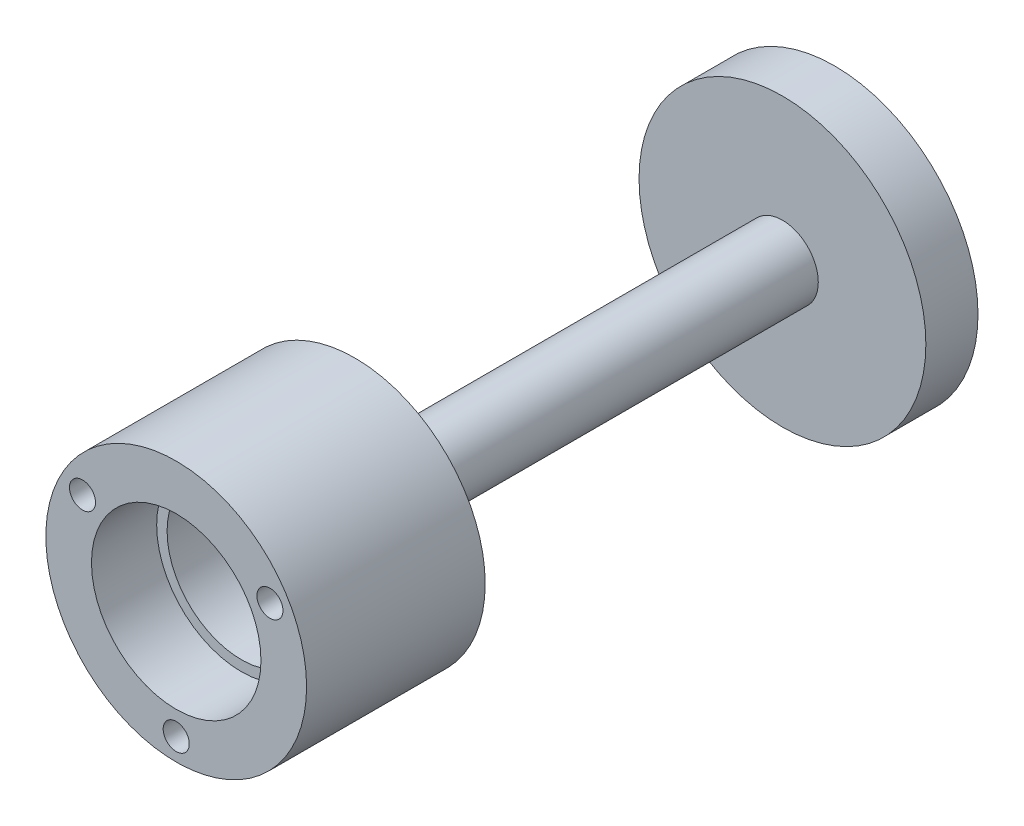
ISO-10303-21;
HEADER;
FILE_DESCRIPTION(('STEP AP214'),'2;1');
FILE_NAME('part.step','',(''),(''),'','','');
FILE_SCHEMA(('AUTOMOTIVE_DESIGN { 1 0 10303 214 1 1 1 1 }'));
ENDSEC;
DATA;
#1=APPLICATION_CONTEXT('core data for automotive mechanical design processes');
#2=APPLICATION_PROTOCOL_DEFINITION('international standard','automotive_design',2000,#1);
#3=PRODUCT_CONTEXT('',#1,'mechanical');
#4=PRODUCT('Part','Part','',(#3));
#5=PRODUCT_RELATED_PRODUCT_CATEGORY('part','',(#4));
#6=PRODUCT_DEFINITION_FORMATION('','',#4);
#7=PRODUCT_DEFINITION_CONTEXT('part definition',#1,'design');
#8=PRODUCT_DEFINITION('design','',#6,#7);
#9=PRODUCT_DEFINITION_SHAPE('','',#8);
#10=(LENGTH_UNIT() NAMED_UNIT(*) SI_UNIT(.MILLI.,.METRE.));
#11=(NAMED_UNIT(*) PLANE_ANGLE_UNIT() SI_UNIT($,.RADIAN.));
#12=(NAMED_UNIT(*) SI_UNIT($,.STERADIAN.) SOLID_ANGLE_UNIT());
#13=UNCERTAINTY_MEASURE_WITH_UNIT(LENGTH_MEASURE(1.E-05),#10,'distance_accuracy_value','');
#14=(GEOMETRIC_REPRESENTATION_CONTEXT(3) GLOBAL_UNCERTAINTY_ASSIGNED_CONTEXT((#13)) GLOBAL_UNIT_ASSIGNED_CONTEXT((#10,
#11,#12)) REPRESENTATION_CONTEXT('',''));
#15=CARTESIAN_POINT('',(0.,0.,0.));
#16=DIRECTION('',(0.,0.,1.));
#17=DIRECTION('',(1.,0.,0.));
#18=AXIS2_PLACEMENT_3D('',#15,#16,#17);
#19=CARTESIAN_POINT('',(0.,0.,32.81));
#20=DIRECTION('',(0.,0.,-1.));
#21=DIRECTION('',(-1.,0.,0.));
#22=AXIS2_PLACEMENT_3D('',#19,#20,#21);
#23=CYLINDRICAL_SURFACE('',#22,2.75);
#24=CARTESIAN_POINT('',(0.,0.,0.));
#25=DIRECTION('',(0.,0.,1.));
#26=DIRECTION('',(1.,0.,0.));
#27=AXIS2_PLACEMENT_3D('',#24,#25,#26);
#28=CIRCLE('',#27,2.75);
#29=CARTESIAN_POINT('',(2.75,0.,0.));
#30=VERTEX_POINT('',#29);
#31=EDGE_CURVE('E46',#30,#30,#28,.T.);
#32=ORIENTED_EDGE('',*,*,#31,.T.);
#33=EDGE_LOOP('',(#32));
#34=FACE_BOUND('',#33,.T.);
#35=CARTESIAN_POINT('',(0.,0.,32.8));
#36=DIRECTION('',(0.,0.,1.));
#37=DIRECTION('',(1.,0.,0.));
#38=AXIS2_PLACEMENT_3D('',#35,#36,#37);
#39=CIRCLE('',#38,2.75);
#40=CARTESIAN_POINT('',(2.75,0.,32.8));
#41=VERTEX_POINT('',#40);
#42=EDGE_CURVE('E10',#41,#41,#39,.T.);
#43=ORIENTED_EDGE('',*,*,#42,.F.);
#44=EDGE_LOOP('',(#43));
#45=FACE_BOUND('',#44,.T.);
#46=ADVANCED_FACE('F39',(#34,#45),#23,.T.);
#47=CARTESIAN_POINT('',(0.,0.,0.));
#48=DIRECTION('',(0.,0.,-1.));
#49=DIRECTION('',(-1.,0.,0.));
#50=AXIS2_PLACEMENT_3D('',#47,#48,#49);
#51=CYLINDRICAL_SURFACE('',#50,11.);
#52=CARTESIAN_POINT('',(0.,0.,0.));
#53=DIRECTION('',(0.,0.,1.));
#54=DIRECTION('',(1.,0.,0.));
#55=AXIS2_PLACEMENT_3D('',#52,#53,#54);
#56=CIRCLE('',#55,11.);
#57=CARTESIAN_POINT('',(11.,0.,0.));
#58=VERTEX_POINT('',#57);
#59=EDGE_CURVE('E49',#58,#58,#56,.T.);
#60=ORIENTED_EDGE('',*,*,#59,.F.);
#61=EDGE_LOOP('',(#60));
#62=FACE_BOUND('',#61,.T.);
#63=CARTESIAN_POINT('',(0.,0.,-4.));
#64=DIRECTION('',(0.,0.,1.));
#65=DIRECTION('',(1.,0.,0.));
#66=AXIS2_PLACEMENT_3D('',#63,#64,#65);
#67=CIRCLE('',#66,11.);
#68=CARTESIAN_POINT('',(11.,0.,-4.));
#69=VERTEX_POINT('',#68);
#70=EDGE_CURVE('E54',#69,#69,#67,.T.);
#71=ORIENTED_EDGE('',*,*,#70,.T.);
#72=EDGE_LOOP('',(#71));
#73=FACE_BOUND('',#72,.T.);
#74=ADVANCED_FACE('F41',(#62,#73),#51,.T.);
#75=CARTESIAN_POINT('',(0.,0.,0.));
#76=DIRECTION('',(0.,0.,1.));
#77=DIRECTION('',(1.,0.,0.));
#78=AXIS2_PLACEMENT_3D('',#75,#76,#77);
#79=PLANE('',#78);
#80=ORIENTED_EDGE('',*,*,#31,.F.);
#81=EDGE_LOOP('',(#80));
#82=FACE_BOUND('',#81,.T.);
#83=ORIENTED_EDGE('',*,*,#59,.T.);
#84=EDGE_LOOP('',(#83));
#85=FACE_BOUND('',#84,.T.);
#86=ADVANCED_FACE('F171',(#82,#85),#79,.T.);
#87=CARTESIAN_POINT('',(0.,0.,-4.));
#88=DIRECTION('',(0.,0.,1.));
#89=DIRECTION('',(1.,0.,0.));
#90=AXIS2_PLACEMENT_3D('',#87,#88,#89);
#91=PLANE('',#90);
#92=CARTESIAN_POINT('',(7.18801085141084,4.15,-4.));
#93=DIRECTION('',(0.,0.,-1.));
#94=DIRECTION('',(-1.,0.,0.));
#95=AXIS2_PLACEMENT_3D('',#92,#93,#94);
#96=CIRCLE('',#95,1.);
#97=CARTESIAN_POINT('',(6.18801085141084,4.15,-4.));
#98=VERTEX_POINT('',#97);
#99=EDGE_CURVE('E100',#98,#98,#96,.T.);
#100=ORIENTED_EDGE('',*,*,#99,.F.);
#101=EDGE_LOOP('',(#100));
#102=FACE_BOUND('',#101,.T.);
#103=CARTESIAN_POINT('',(-7.18801085141084,4.15,-4.));
#104=DIRECTION('',(0.,0.,-1.));
#105=DIRECTION('',(-1.,0.,0.));
#106=AXIS2_PLACEMENT_3D('',#103,#104,#105);
#107=CIRCLE('',#106,1.);
#108=CARTESIAN_POINT('',(-8.18801085141084,4.15,-4.));
#109=VERTEX_POINT('',#108);
#110=EDGE_CURVE('E94',#109,#109,#107,.T.);
#111=ORIENTED_EDGE('',*,*,#110,.F.);
#112=EDGE_LOOP('',(#111));
#113=FACE_BOUND('',#112,.T.);
#114=CARTESIAN_POINT('',(0.,-8.3,-4.));
#115=DIRECTION('',(0.,0.,-1.));
#116=DIRECTION('',(-1.,0.,0.));
#117=AXIS2_PLACEMENT_3D('',#114,#115,#116);
#118=CIRCLE('',#117,1.);
#119=CARTESIAN_POINT('',(-1.,-8.3,-4.));
#120=VERTEX_POINT('',#119);
#121=EDGE_CURVE('E87',#120,#120,#118,.T.);
#122=ORIENTED_EDGE('',*,*,#121,.F.);
#123=EDGE_LOOP('',(#122));
#124=FACE_BOUND('',#123,.T.);
#125=ORIENTED_EDGE('',*,*,#70,.F.);
#126=EDGE_LOOP('',(#125));
#127=FACE_BOUND('',#126,.T.);
#128=ADVANCED_FACE('F178',(#102,#113,#124,#127),#91,.F.);
#129=CARTESIAN_POINT('',(0.,0.,35.));
#130=DIRECTION('',(0.,0.,-1.));
#131=DIRECTION('',(-1.,0.,0.));
#132=AXIS2_PLACEMENT_3D('',#129,#130,#131);
#133=CYLINDRICAL_SURFACE('',#132,10.);
#134=CARTESIAN_POINT('',(0.,0.,32.8));
#135=DIRECTION('',(0.,0.,1.));
#136=DIRECTION('',(1.,0.,0.));
#137=AXIS2_PLACEMENT_3D('',#134,#135,#136);
#138=CIRCLE('',#137,10.);
#139=CARTESIAN_POINT('',(10.,0.,32.8));
#140=VERTEX_POINT('',#139);
#141=EDGE_CURVE('E59',#140,#140,#138,.T.);
#142=ORIENTED_EDGE('',*,*,#141,.T.);
#143=EDGE_LOOP('',(#142));
#144=FACE_BOUND('',#143,.T.);
#145=CARTESIAN_POINT('',(0.,0.,46.5));
#146=DIRECTION('',(0.,0.,1.));
#147=DIRECTION('',(1.,0.,0.));
#148=AXIS2_PLACEMENT_3D('',#145,#146,#147);
#149=CIRCLE('',#148,10.);
#150=CARTESIAN_POINT('',(10.,0.,46.5));
#151=VERTEX_POINT('',#150);
#152=EDGE_CURVE('E71',#151,#151,#149,.T.);
#153=ORIENTED_EDGE('',*,*,#152,.F.);
#154=EDGE_LOOP('',(#153));
#155=FACE_BOUND('',#154,.T.);
#156=ADVANCED_FACE('F177',(#144,#155),#133,.T.);
#157=CARTESIAN_POINT('',(0.,0.,32.8));
#158=DIRECTION('',(0.,0.,1.));
#159=DIRECTION('',(1.,0.,0.));
#160=AXIS2_PLACEMENT_3D('',#157,#158,#159);
#161=PLANE('',#160);
#162=ORIENTED_EDGE('',*,*,#42,.T.);
#163=EDGE_LOOP('',(#162));
#164=FACE_BOUND('',#163,.T.);
#165=ORIENTED_EDGE('',*,*,#141,.F.);
#166=EDGE_LOOP('',(#165));
#167=FACE_BOUND('',#166,.T.);
#168=ADVANCED_FACE('F135',(#164,#167),#161,.F.);
#169=CARTESIAN_POINT('',(0.,0.,46.5));
#170=DIRECTION('',(0.,0.,1.));
#171=DIRECTION('',(1.,0.,0.));
#172=AXIS2_PLACEMENT_3D('',#169,#170,#171);
#173=PLANE('',#172);
#174=CARTESIAN_POINT('',(7.18801085141084,4.15,46.5));
#175=DIRECTION('',(0.,0.,1.));
#176=DIRECTION('',(1.,0.,0.));
#177=AXIS2_PLACEMENT_3D('',#174,#175,#176);
#178=CIRCLE('',#177,1.);
#179=CARTESIAN_POINT('',(8.18801085141084,4.15,46.5));
#180=VERTEX_POINT('',#179);
#181=EDGE_CURVE('E111',#180,#180,#178,.T.);
#182=ORIENTED_EDGE('',*,*,#181,.F.);
#183=EDGE_LOOP('',(#182));
#184=FACE_BOUND('',#183,.T.);
#185=CARTESIAN_POINT('',(-7.18801085141084,4.15,46.5));
#186=DIRECTION('',(0.,0.,1.));
#187=DIRECTION('',(1.,0.,0.));
#188=AXIS2_PLACEMENT_3D('',#185,#186,#187);
#189=CIRCLE('',#188,1.);
#190=CARTESIAN_POINT('',(-6.18801085141084,4.15,46.5));
#191=VERTEX_POINT('',#190);
#192=EDGE_CURVE('E112',#191,#191,#189,.T.);
#193=ORIENTED_EDGE('',*,*,#192,.F.);
#194=EDGE_LOOP('',(#193));
#195=FACE_BOUND('',#194,.T.);
#196=CARTESIAN_POINT('',(0.,-8.3,46.5));
#197=DIRECTION('',(0.,0.,1.));
#198=DIRECTION('',(1.,0.,0.));
#199=AXIS2_PLACEMENT_3D('',#196,#197,#198);
#200=CIRCLE('',#199,1.);
#201=CARTESIAN_POINT('',(0.999999999999999,-8.3,46.5));
#202=VERTEX_POINT('',#201);
#203=EDGE_CURVE('E104',#202,#202,#200,.T.);
#204=ORIENTED_EDGE('',*,*,#203,.F.);
#205=EDGE_LOOP('',(#204));
#206=FACE_BOUND('',#205,.T.);
#207=ORIENTED_EDGE('',*,*,#152,.T.);
#208=EDGE_LOOP('',(#207));
#209=FACE_BOUND('',#208,.T.);
#210=CARTESIAN_POINT('',(0.,0.,46.5));
#211=DIRECTION('',(0.,0.,1.));
#212=DIRECTION('',(1.,0.,0.));
#213=AXIS2_PLACEMENT_3D('',#210,#211,#212);
#214=CIRCLE('',#213,6.5);
#215=CARTESIAN_POINT('',(6.5,0.,46.5));
#216=VERTEX_POINT('',#215);
#217=EDGE_CURVE('E76',#216,#216,#214,.T.);
#218=ORIENTED_EDGE('',*,*,#217,.F.);
#219=EDGE_LOOP('',(#218));
#220=FACE_BOUND('',#219,.T.);
#221=ADVANCED_FACE('F129',(#184,#195,#206,#209,#220),#173,.T.);
#222=CARTESIAN_POINT('',(0.,0.,46.5));
#223=DIRECTION('',(0.,0.,-1.));
#224=DIRECTION('',(-1.,0.,0.));
#225=AXIS2_PLACEMENT_3D('',#222,#223,#224);
#226=CYLINDRICAL_SURFACE('',#225,6.5);
#227=ORIENTED_EDGE('',*,*,#217,.T.);
#228=EDGE_LOOP('',(#227));
#229=FACE_BOUND('',#228,.T.);
#230=CARTESIAN_POINT('',(0.,0.,41.5));
#231=DIRECTION('',(0.,0.,1.));
#232=DIRECTION('',(1.,0.,0.));
#233=AXIS2_PLACEMENT_3D('',#230,#231,#232);
#234=CIRCLE('',#233,6.5);
#235=CARTESIAN_POINT('',(6.5,0.,41.5));
#236=VERTEX_POINT('',#235);
#237=EDGE_CURVE('E80',#236,#236,#234,.T.);
#238=ORIENTED_EDGE('',*,*,#237,.F.);
#239=EDGE_LOOP('',(#238));
#240=FACE_BOUND('',#239,.T.);
#241=ADVANCED_FACE('F131',(#229,#240),#226,.F.);
#242=CARTESIAN_POINT('',(0.,0.,35.));
#243=DIRECTION('',(0.,0.,1.));
#244=DIRECTION('',(1.,0.,0.));
#245=AXIS2_PLACEMENT_3D('',#242,#243,#244);
#246=PLANE('',#245);
#247=CARTESIAN_POINT('',(0.,0.,35.));
#248=DIRECTION('',(0.,0.,1.));
#249=DIRECTION('',(1.,0.,0.));
#250=AXIS2_PLACEMENT_3D('',#247,#248,#249);
#251=CIRCLE('',#250,5.7);
#252=CARTESIAN_POINT('',(-5.7,0.,35.));
#253=VERTEX_POINT('',#252);
#254=EDGE_CURVE('E69',#253,#253,#251,.T.);
#255=ORIENTED_EDGE('',*,*,#254,.T.);
#256=EDGE_LOOP('',(#255));
#257=FACE_BOUND('',#256,.T.);
#258=ADVANCED_FACE('F144',(#257),#246,.T.);
#259=CARTESIAN_POINT('',(0.,0.,41.5));
#260=DIRECTION('',(0.,0.,-1.));
#261=DIRECTION('',(-1.,0.,0.));
#262=AXIS2_PLACEMENT_3D('',#259,#260,#261);
#263=CYLINDRICAL_SURFACE('',#262,5.7);
#264=CARTESIAN_POINT('',(0.,0.,41.5));
#265=DIRECTION('',(0.,0.,1.));
#266=DIRECTION('',(1.,0.,0.));
#267=AXIS2_PLACEMENT_3D('',#264,#265,#266);
#268=CIRCLE('',#267,5.7);
#269=CARTESIAN_POINT('',(-5.7,0.,41.5));
#270=VERTEX_POINT('',#269);
#271=EDGE_CURVE('E63',#270,#270,#268,.T.);
#272=CARTESIAN_POINT('',(-5.7,0.,41.5));
#273=CARTESIAN_POINT('',(-5.7,0.,41.4322916666667));
#274=CARTESIAN_POINT('',(-5.7,0.,41.3645833333333));
#275=CARTESIAN_POINT('',(-5.7,0.,41.2291666666667));
#276=CARTESIAN_POINT('',(-5.7,0.,41.1614583333333));
#277=CARTESIAN_POINT('',(-5.7,0.,41.0260416666667));
#278=CARTESIAN_POINT('',(-5.7,0.,40.9583333333333));
#279=CARTESIAN_POINT('',(-5.7,0.,40.8229166666667));
#280=CARTESIAN_POINT('',(-5.7,0.,40.7552083333333));
#281=CARTESIAN_POINT('',(-5.7,0.,40.6197916666667));
#282=CARTESIAN_POINT('',(-5.7,0.,40.5520833333333));
#283=CARTESIAN_POINT('',(-5.7,0.,40.4166666666667));
#284=CARTESIAN_POINT('',(-5.7,0.,40.3489583333333));
#285=CARTESIAN_POINT('',(-5.7,0.,40.2135416666667));
#286=CARTESIAN_POINT('',(-5.7,0.,40.1458333333333));
#287=CARTESIAN_POINT('',(-5.7,0.,40.0104166666667));
#288=CARTESIAN_POINT('',(-5.7,0.,39.9427083333333));
#289=CARTESIAN_POINT('',(-5.7,0.,39.8072916666667));
#290=CARTESIAN_POINT('',(-5.7,0.,39.7395833333333));
#291=CARTESIAN_POINT('',(-5.7,0.,39.6041666666667));
#292=CARTESIAN_POINT('',(-5.7,0.,39.5364583333333));
#293=CARTESIAN_POINT('',(-5.7,0.,39.4010416666667));
#294=CARTESIAN_POINT('',(-5.7,0.,39.3333333333333));
#295=CARTESIAN_POINT('',(-5.7,0.,39.1979166666667));
#296=CARTESIAN_POINT('',(-5.7,0.,39.1302083333333));
#297=CARTESIAN_POINT('',(-5.7,0.,38.9947916666667));
#298=CARTESIAN_POINT('',(-5.7,0.,38.9270833333333));
#299=CARTESIAN_POINT('',(-5.7,0.,38.7916666666667));
#300=CARTESIAN_POINT('',(-5.7,0.,38.7239583333333));
#301=CARTESIAN_POINT('',(-5.7,0.,38.5885416666667));
#302=CARTESIAN_POINT('',(-5.7,0.,38.5208333333333));
#303=CARTESIAN_POINT('',(-5.7,0.,38.3854166666667));
#304=CARTESIAN_POINT('',(-5.7,0.,38.3177083333333));
#305=CARTESIAN_POINT('',(-5.7,0.,38.1822916666667));
#306=CARTESIAN_POINT('',(-5.7,0.,38.1145833333333));
#307=CARTESIAN_POINT('',(-5.7,0.,37.9791666666667));
#308=CARTESIAN_POINT('',(-5.7,0.,37.9114583333333));
#309=CARTESIAN_POINT('',(-5.7,0.,37.7760416666667));
#310=CARTESIAN_POINT('',(-5.7,0.,37.7083333333333));
#311=CARTESIAN_POINT('',(-5.7,0.,37.5729166666667));
#312=CARTESIAN_POINT('',(-5.7,0.,37.5052083333333));
#313=CARTESIAN_POINT('',(-5.7,0.,37.3697916666667));
#314=CARTESIAN_POINT('',(-5.7,0.,37.3020833333333));
#315=CARTESIAN_POINT('',(-5.7,0.,37.1666666666667));
#316=CARTESIAN_POINT('',(-5.7,0.,37.0989583333333));
#317=CARTESIAN_POINT('',(-5.7,0.,36.9635416666667));
#318=CARTESIAN_POINT('',(-5.7,0.,36.8958333333333));
#319=CARTESIAN_POINT('',(-5.7,0.,36.7604166666667));
#320=CARTESIAN_POINT('',(-5.7,0.,36.6927083333333));
#321=CARTESIAN_POINT('',(-5.7,0.,36.5572916666667));
#322=CARTESIAN_POINT('',(-5.7,0.,36.4895833333333));
#323=CARTESIAN_POINT('',(-5.7,0.,36.3541666666667));
#324=CARTESIAN_POINT('',(-5.7,0.,36.2864583333333));
#325=CARTESIAN_POINT('',(-5.7,0.,36.1510416666667));
#326=CARTESIAN_POINT('',(-5.7,0.,36.0833333333333));
#327=CARTESIAN_POINT('',(-5.7,0.,35.9479166666667));
#328=CARTESIAN_POINT('',(-5.7,0.,35.8802083333333));
#329=CARTESIAN_POINT('',(-5.7,0.,35.7447916666667));
#330=CARTESIAN_POINT('',(-5.7,0.,35.6770833333333));
#331=CARTESIAN_POINT('',(-5.7,0.,35.5416666666667));
#332=CARTESIAN_POINT('',(-5.7,0.,35.4739583333333));
#333=CARTESIAN_POINT('',(-5.7,0.,35.3385416666667));
#334=CARTESIAN_POINT('',(-5.7,0.,35.2708333333333));
#335=CARTESIAN_POINT('',(-5.7,0.,35.1354166666667));
#336=CARTESIAN_POINT('',(-5.7,0.,35.0677083333333));
#337=CARTESIAN_POINT('',(-5.7,0.,35.));
#338=B_SPLINE_CURVE_WITH_KNOTS('',3,(#272,#273,#274,#275,#276,#277,#278,#279,#280,#281,#282,
#283,#284,#285,#286,#287,#288,#289,#290,#291,#292,#293,#294,#295,#296,#297,#298,#299,#300,#301,
#302,#303,#304,#305,#306,#307,#308,#309,#310,#311,#312,#313,#314,#315,#316,#317,#318,#319,#320,
#321,#322,#323,#324,#325,#326,#327,#328,#329,#330,#331,#332,#333,#334,#335,#336,#337),
.UNSPECIFIED.,.F.,.F.,(4,2,2,2,2,2,2,2,2,2,2,2,2,2,2,2,2,2,2,2,2,2,2,2,2,2,2,2,2,2,2,2,4),(0.,
0.203124999999998,0.406249999999997,0.609374999999995,0.812499999999994,1.015625,1.21875,
1.421875,1.62499999999999,1.828125,2.03125,2.234375,2.4375,2.64062499999999,2.84375,3.046875,
3.25,3.45312499999999,3.65625,3.859375,4.0625,4.26562499999999,4.46874999999999,4.671875,4.875,
5.078125,5.28124999999999,5.484375,5.6875,5.890625,6.09374999999999,6.29687499999999,6.5),.UNSPECIFIED.);
#339=EDGE_CURVE('BSEAM155',#270,#253,#338,.T.);
#340=ORIENTED_EDGE('',*,*,#271,.T.);
#341=ORIENTED_EDGE('',*,*,#254,.F.);
#342=ORIENTED_EDGE('',*,*,#339,.T.);
#343=ORIENTED_EDGE('',*,*,#339,.F.);
#344=EDGE_LOOP('',(#340,#342,#341,#343));
#345=FACE_BOUND('',#344,.T.);
#346=ADVANCED_FACE('F155',(#345),#263,.F.);
#347=CARTESIAN_POINT('',(0.,0.,41.5));
#348=DIRECTION('',(0.,0.,1.));
#349=DIRECTION('',(1.,0.,0.));
#350=AXIS2_PLACEMENT_3D('',#347,#348,#349);
#351=PLANE('',#350);
#352=ORIENTED_EDGE('',*,*,#271,.F.);
#353=EDGE_LOOP('',(#352));
#354=FACE_BOUND('',#353,.T.);
#355=ORIENTED_EDGE('',*,*,#237,.T.);
#356=EDGE_LOOP('',(#355));
#357=FACE_BOUND('',#356,.T.);
#358=ADVANCED_FACE('F149',(#354,#357),#351,.T.);
#359=CARTESIAN_POINT('',(0.,-8.3,-0.4));
#360=DIRECTION('',(0.,0.,-1.));
#361=DIRECTION('',(-1.,0.,0.));
#362=AXIS2_PLACEMENT_3D('',#359,#360,#361);
#363=CYLINDRICAL_SURFACE('',#362,1.);
#364=CARTESIAN_POINT('',(0.,-8.3,-0.4));
#365=DIRECTION('',(0.,0.,-1.));
#366=DIRECTION('',(-1.,0.,0.));
#367=AXIS2_PLACEMENT_3D('',#364,#365,#366);
#368=CIRCLE('',#367,1.);
#369=CARTESIAN_POINT('',(-1.,-8.3,-0.4));
#370=VERTEX_POINT('',#369);
#371=EDGE_CURVE('E83',#370,#370,#368,.T.);
#372=ORIENTED_EDGE('',*,*,#371,.F.);
#373=EDGE_LOOP('',(#372));
#374=FACE_BOUND('',#373,.T.);
#375=ORIENTED_EDGE('',*,*,#121,.T.);
#376=EDGE_LOOP('',(#375));
#377=FACE_BOUND('',#376,.T.);
#378=ADVANCED_FACE('F151',(#374,#377),#363,.F.);
#379=CARTESIAN_POINT('',(0.,-8.3,-0.4));
#380=DIRECTION('',(0.,0.,-1.));
#381=DIRECTION('',(-1.,0.,0.));
#382=AXIS2_PLACEMENT_3D('',#379,#380,#381);
#383=PLANE('',#382);
#384=ORIENTED_EDGE('',*,*,#371,.T.);
#385=EDGE_LOOP('',(#384));
#386=FACE_BOUND('',#385,.T.);
#387=ADVANCED_FACE('F157',(#386),#383,.T.);
#388=CARTESIAN_POINT('',(-7.18801085141084,4.15,-0.4));
#389=DIRECTION('',(0.,0.,-1.));
#390=DIRECTION('',(-1.,0.,0.));
#391=AXIS2_PLACEMENT_3D('',#388,#389,#390);
#392=CYLINDRICAL_SURFACE('',#391,1.);
#393=CARTESIAN_POINT('',(-7.18801085141084,4.15,-0.4));
#394=DIRECTION('',(0.,0.,-1.));
#395=DIRECTION('',(-1.,0.,0.));
#396=AXIS2_PLACEMENT_3D('',#393,#394,#395);
#397=CIRCLE('',#396,1.);
#398=CARTESIAN_POINT('',(-8.18801085141084,4.15,-0.4));
#399=VERTEX_POINT('',#398);
#400=EDGE_CURVE('E93',#399,#399,#397,.T.);
#401=ORIENTED_EDGE('',*,*,#400,.F.);
#402=EDGE_LOOP('',(#401));
#403=FACE_BOUND('',#402,.T.);
#404=ORIENTED_EDGE('',*,*,#110,.T.);
#405=EDGE_LOOP('',(#404));
#406=FACE_BOUND('',#405,.T.);
#407=ADVANCED_FACE('F194',(#403,#406),#392,.F.);
#408=CARTESIAN_POINT('',(-7.18801085141084,4.15,-0.4));
#409=DIRECTION('',(0.,0.,-1.));
#410=DIRECTION('',(-1.,0.,0.));
#411=AXIS2_PLACEMENT_3D('',#408,#409,#410);
#412=PLANE('',#411);
#413=ORIENTED_EDGE('',*,*,#400,.T.);
#414=EDGE_LOOP('',(#413));
#415=FACE_BOUND('',#414,.T.);
#416=ADVANCED_FACE('F195',(#415),#412,.T.);
#417=CARTESIAN_POINT('',(7.18801085141084,4.15,-0.4));
#418=DIRECTION('',(0.,0.,-1.));
#419=DIRECTION('',(-1.,0.,0.));
#420=AXIS2_PLACEMENT_3D('',#417,#418,#419);
#421=CYLINDRICAL_SURFACE('',#420,1.);
#422=CARTESIAN_POINT('',(7.18801085141084,4.15,-0.4));
#423=DIRECTION('',(0.,0.,-1.));
#424=DIRECTION('',(-1.,0.,0.));
#425=AXIS2_PLACEMENT_3D('',#422,#423,#424);
#426=CIRCLE('',#425,1.);
#427=CARTESIAN_POINT('',(6.18801085141084,4.15,-0.4));
#428=VERTEX_POINT('',#427);
#429=EDGE_CURVE('E81',#428,#428,#426,.T.);
#430=ORIENTED_EDGE('',*,*,#429,.F.);
#431=EDGE_LOOP('',(#430));
#432=FACE_BOUND('',#431,.T.);
#433=ORIENTED_EDGE('',*,*,#99,.T.);
#434=EDGE_LOOP('',(#433));
#435=FACE_BOUND('',#434,.T.);
#436=ADVANCED_FACE('F205',(#432,#435),#421,.F.);
#437=CARTESIAN_POINT('',(7.18801085141084,4.15,-0.4));
#438=DIRECTION('',(0.,0.,-1.));
#439=DIRECTION('',(-1.,0.,0.));
#440=AXIS2_PLACEMENT_3D('',#437,#438,#439);
#441=PLANE('',#440);
#442=ORIENTED_EDGE('',*,*,#429,.T.);
#443=EDGE_LOOP('',(#442));
#444=FACE_BOUND('',#443,.T.);
#445=ADVANCED_FACE('F211',(#444),#441,.T.);
#446=CARTESIAN_POINT('',(0.,-8.3,42.2));
#447=DIRECTION('',(0.,0.,1.));
#448=DIRECTION('',(1.,0.,0.));
#449=AXIS2_PLACEMENT_3D('',#446,#447,#448);
#450=CYLINDRICAL_SURFACE('',#449,1.);
#451=CARTESIAN_POINT('',(0.,-8.3,42.2));
#452=DIRECTION('',(0.,0.,1.));
#453=DIRECTION('',(1.,0.,0.));
#454=AXIS2_PLACEMENT_3D('',#451,#452,#453);
#455=CIRCLE('',#454,1.);
#456=CARTESIAN_POINT('',(0.999999999999999,-8.3,42.2));
#457=VERTEX_POINT('',#456);
#458=EDGE_CURVE('E105',#457,#457,#455,.T.);
#459=CARTESIAN_POINT('',(0.999999999999999,-8.3,42.2));
#460=CARTESIAN_POINT('',(0.999999999999999,-8.3,42.2447916666667));
#461=CARTESIAN_POINT('',(0.999999999999999,-8.3,42.2895833333333));
#462=CARTESIAN_POINT('',(0.999999999999999,-8.3,42.3791666666667));
#463=CARTESIAN_POINT('',(0.999999999999999,-8.3,42.4239583333333));
#464=CARTESIAN_POINT('',(0.999999999999999,-8.3,42.5135416666667));
#465=CARTESIAN_POINT('',(0.999999999999999,-8.3,42.5583333333333));
#466=CARTESIAN_POINT('',(0.999999999999999,-8.3,42.6479166666667));
#467=CARTESIAN_POINT('',(0.999999999999999,-8.3,42.6927083333333));
#468=CARTESIAN_POINT('',(0.999999999999999,-8.3,42.7822916666667));
#469=CARTESIAN_POINT('',(0.999999999999999,-8.3,42.8270833333333));
#470=CARTESIAN_POINT('',(0.999999999999999,-8.3,42.9166666666667));
#471=CARTESIAN_POINT('',(0.999999999999999,-8.3,42.9614583333333));
#472=CARTESIAN_POINT('',(0.999999999999999,-8.3,43.0510416666667));
#473=CARTESIAN_POINT('',(0.999999999999999,-8.3,43.0958333333333));
#474=CARTESIAN_POINT('',(0.999999999999999,-8.3,43.1854166666667));
#475=CARTESIAN_POINT('',(0.999999999999999,-8.3,43.2302083333333));
#476=CARTESIAN_POINT('',(0.999999999999999,-8.3,43.3197916666667));
#477=CARTESIAN_POINT('',(0.999999999999999,-8.3,43.3645833333333));
#478=CARTESIAN_POINT('',(0.999999999999999,-8.3,43.4541666666667));
#479=CARTESIAN_POINT('',(0.999999999999999,-8.3,43.4989583333333));
#480=CARTESIAN_POINT('',(0.999999999999999,-8.3,43.5885416666667));
#481=CARTESIAN_POINT('',(0.999999999999999,-8.3,43.6333333333333));
#482=CARTESIAN_POINT('',(0.999999999999999,-8.3,43.7229166666667));
#483=CARTESIAN_POINT('',(0.999999999999999,-8.3,43.7677083333333));
#484=CARTESIAN_POINT('',(0.999999999999999,-8.3,43.8572916666667));
#485=CARTESIAN_POINT('',(0.999999999999999,-8.3,43.9020833333333));
#486=CARTESIAN_POINT('',(0.999999999999999,-8.3,43.9916666666667));
#487=CARTESIAN_POINT('',(0.999999999999999,-8.3,44.0364583333333));
#488=CARTESIAN_POINT('',(0.999999999999999,-8.3,44.1260416666667));
#489=CARTESIAN_POINT('',(0.999999999999999,-8.3,44.1708333333333));
#490=CARTESIAN_POINT('',(0.999999999999999,-8.3,44.2604166666667));
#491=CARTESIAN_POINT('',(0.999999999999999,-8.3,44.3052083333333));
#492=CARTESIAN_POINT('',(0.999999999999999,-8.3,44.3947916666667));
#493=CARTESIAN_POINT('',(0.999999999999999,-8.3,44.4395833333333));
#494=CARTESIAN_POINT('',(0.999999999999999,-8.3,44.5291666666667));
#495=CARTESIAN_POINT('',(0.999999999999999,-8.3,44.5739583333333));
#496=CARTESIAN_POINT('',(0.999999999999999,-8.3,44.6635416666667));
#497=CARTESIAN_POINT('',(0.999999999999999,-8.3,44.7083333333333));
#498=CARTESIAN_POINT('',(0.999999999999999,-8.3,44.7979166666667));
#499=CARTESIAN_POINT('',(0.999999999999999,-8.3,44.8427083333333));
#500=CARTESIAN_POINT('',(0.999999999999999,-8.3,44.9322916666667));
#501=CARTESIAN_POINT('',(0.999999999999999,-8.3,44.9770833333333));
#502=CARTESIAN_POINT('',(0.999999999999999,-8.3,45.0666666666667));
#503=CARTESIAN_POINT('',(0.999999999999999,-8.3,45.1114583333333));
#504=CARTESIAN_POINT('',(0.999999999999999,-8.3,45.2010416666667));
#505=CARTESIAN_POINT('',(0.999999999999999,-8.3,45.2458333333333));
#506=CARTESIAN_POINT('',(0.999999999999999,-8.3,45.3354166666667));
#507=CARTESIAN_POINT('',(0.999999999999999,-8.3,45.3802083333333));
#508=CARTESIAN_POINT('',(0.999999999999999,-8.3,45.4697916666667));
#509=CARTESIAN_POINT('',(0.999999999999999,-8.3,45.5145833333333));
#510=CARTESIAN_POINT('',(0.999999999999999,-8.3,45.6041666666667));
#511=CARTESIAN_POINT('',(0.999999999999999,-8.3,45.6489583333333));
#512=CARTESIAN_POINT('',(0.999999999999999,-8.3,45.7385416666667));
#513=CARTESIAN_POINT('',(0.999999999999999,-8.3,45.7833333333333));
#514=CARTESIAN_POINT('',(0.999999999999999,-8.3,45.8729166666667));
#515=CARTESIAN_POINT('',(0.999999999999999,-8.3,45.9177083333333));
#516=CARTESIAN_POINT('',(0.999999999999999,-8.3,46.0072916666667));
#517=CARTESIAN_POINT('',(0.999999999999999,-8.3,46.0520833333333));
#518=CARTESIAN_POINT('',(0.999999999999999,-8.3,46.1416666666667));
#519=CARTESIAN_POINT('',(0.999999999999999,-8.3,46.1864583333333));
#520=CARTESIAN_POINT('',(0.999999999999999,-8.3,46.2760416666667));
#521=CARTESIAN_POINT('',(0.999999999999999,-8.3,46.3208333333333));
#522=CARTESIAN_POINT('',(0.999999999999999,-8.3,46.4104166666667));
#523=CARTESIAN_POINT('',(0.999999999999999,-8.3,46.4552083333333));
#524=CARTESIAN_POINT('',(0.999999999999999,-8.3,46.5));
#525=B_SPLINE_CURVE_WITH_KNOTS('',3,(#459,#460,#461,#462,#463,#464,#465,#466,#467,#468,#469,
#470,#471,#472,#473,#474,#475,#476,#477,#478,#479,#480,#481,#482,#483,#484,#485,#486,#487,#488,
#489,#490,#491,#492,#493,#494,#495,#496,#497,#498,#499,#500,#501,#502,#503,#504,#505,#506,#507,
#508,#509,#510,#511,#512,#513,#514,#515,#516,#517,#518,#519,#520,#521,#522,#523,#524),
.UNSPECIFIED.,.F.,.F.,(4,2,2,2,2,2,2,2,2,2,2,2,2,2,2,2,2,2,2,2,2,2,2,2,2,2,2,2,2,2,2,2,4),(0.,
0.134375000000006,0.268750000000005,0.403125000000004,0.537500000000003,0.671875000000002,
0.806250000000001,0.940625,1.075,1.20937500000001,1.34375,1.478125,1.6125,1.746875,1.88125,
2.015625,2.15,2.28437500000001,2.41875,2.553125,2.6875,2.821875,2.95625,3.090625,3.225,3.359375,
3.49375,3.628125,3.7625,3.896875,4.03125,4.165625,4.3),.UNSPECIFIED.);
#526=EDGE_CURVE('BSEAM214',#457,#202,#525,.T.);
#527=ORIENTED_EDGE('',*,*,#458,.F.);
#528=ORIENTED_EDGE('',*,*,#203,.T.);
#529=ORIENTED_EDGE('',*,*,#526,.T.);
#530=ORIENTED_EDGE('',*,*,#526,.F.);
#531=EDGE_LOOP('',(#527,#529,#528,#530));
#532=FACE_BOUND('',#531,.T.);
#533=ADVANCED_FACE('F214',(#532),#450,.F.);
#534=CARTESIAN_POINT('',(0.,-8.3,42.2));
#535=DIRECTION('',(0.,0.,1.));
#536=DIRECTION('',(1.,0.,0.));
#537=AXIS2_PLACEMENT_3D('',#534,#535,#536);
#538=PLANE('',#537);
#539=ORIENTED_EDGE('',*,*,#458,.T.);
#540=EDGE_LOOP('',(#539));
#541=FACE_BOUND('',#540,.T.);
#542=ADVANCED_FACE('F220',(#541),#538,.T.);
#543=CARTESIAN_POINT('',(-7.18801085141084,4.15,42.2));
#544=DIRECTION('',(0.,0.,1.));
#545=DIRECTION('',(1.,0.,0.));
#546=AXIS2_PLACEMENT_3D('',#543,#544,#545);
#547=CYLINDRICAL_SURFACE('',#546,1.);
#548=CARTESIAN_POINT('',(-7.18801085141084,4.15,42.2));
#549=DIRECTION('',(0.,0.,1.));
#550=DIRECTION('',(1.,0.,0.));
#551=AXIS2_PLACEMENT_3D('',#548,#549,#550);
#552=CIRCLE('',#551,1.);
#553=CARTESIAN_POINT('',(-6.18801085141084,4.15,42.2));
#554=VERTEX_POINT('',#553);
#555=EDGE_CURVE('E107',#554,#554,#552,.T.);
#556=CARTESIAN_POINT('',(-6.18801085141084,4.15,42.2));
#557=CARTESIAN_POINT('',(-6.18801085141084,4.15,42.2447916666667));
#558=CARTESIAN_POINT('',(-6.18801085141084,4.15,42.2895833333333));
#559=CARTESIAN_POINT('',(-6.18801085141084,4.15,42.3791666666667));
#560=CARTESIAN_POINT('',(-6.18801085141084,4.15,42.4239583333333));
#561=CARTESIAN_POINT('',(-6.18801085141084,4.15,42.5135416666667));
#562=CARTESIAN_POINT('',(-6.18801085141084,4.15,42.5583333333333));
#563=CARTESIAN_POINT('',(-6.18801085141084,4.15,42.6479166666667));
#564=CARTESIAN_POINT('',(-6.18801085141084,4.15,42.6927083333333));
#565=CARTESIAN_POINT('',(-6.18801085141084,4.15,42.7822916666667));
#566=CARTESIAN_POINT('',(-6.18801085141084,4.15,42.8270833333333));
#567=CARTESIAN_POINT('',(-6.18801085141084,4.15,42.9166666666667));
#568=CARTESIAN_POINT('',(-6.18801085141084,4.15,42.9614583333333));
#569=CARTESIAN_POINT('',(-6.18801085141084,4.15,43.0510416666667));
#570=CARTESIAN_POINT('',(-6.18801085141084,4.15,43.0958333333333));
#571=CARTESIAN_POINT('',(-6.18801085141084,4.15,43.1854166666667));
#572=CARTESIAN_POINT('',(-6.18801085141084,4.15,43.2302083333333));
#573=CARTESIAN_POINT('',(-6.18801085141084,4.15,43.3197916666667));
#574=CARTESIAN_POINT('',(-6.18801085141084,4.15,43.3645833333333));
#575=CARTESIAN_POINT('',(-6.18801085141084,4.15,43.4541666666667));
#576=CARTESIAN_POINT('',(-6.18801085141084,4.15,43.4989583333333));
#577=CARTESIAN_POINT('',(-6.18801085141084,4.15,43.5885416666667));
#578=CARTESIAN_POINT('',(-6.18801085141084,4.15,43.6333333333333));
#579=CARTESIAN_POINT('',(-6.18801085141084,4.15,43.7229166666667));
#580=CARTESIAN_POINT('',(-6.18801085141084,4.15,43.7677083333333));
#581=CARTESIAN_POINT('',(-6.18801085141084,4.15,43.8572916666667));
#582=CARTESIAN_POINT('',(-6.18801085141084,4.15,43.9020833333333));
#583=CARTESIAN_POINT('',(-6.18801085141084,4.15,43.9916666666667));
#584=CARTESIAN_POINT('',(-6.18801085141084,4.15,44.0364583333333));
#585=CARTESIAN_POINT('',(-6.18801085141084,4.15,44.1260416666667));
#586=CARTESIAN_POINT('',(-6.18801085141084,4.15,44.1708333333333));
#587=CARTESIAN_POINT('',(-6.18801085141084,4.15,44.2604166666667));
#588=CARTESIAN_POINT('',(-6.18801085141084,4.15,44.3052083333333));
#589=CARTESIAN_POINT('',(-6.18801085141084,4.15,44.3947916666667));
#590=CARTESIAN_POINT('',(-6.18801085141084,4.15,44.4395833333333));
#591=CARTESIAN_POINT('',(-6.18801085141084,4.15,44.5291666666667));
#592=CARTESIAN_POINT('',(-6.18801085141084,4.15,44.5739583333333));
#593=CARTESIAN_POINT('',(-6.18801085141084,4.15,44.6635416666667));
#594=CARTESIAN_POINT('',(-6.18801085141084,4.15,44.7083333333333));
#595=CARTESIAN_POINT('',(-6.18801085141084,4.15,44.7979166666667));
#596=CARTESIAN_POINT('',(-6.18801085141084,4.15,44.8427083333333));
#597=CARTESIAN_POINT('',(-6.18801085141084,4.15,44.9322916666667));
#598=CARTESIAN_POINT('',(-6.18801085141084,4.15,44.9770833333333));
#599=CARTESIAN_POINT('',(-6.18801085141084,4.15,45.0666666666667));
#600=CARTESIAN_POINT('',(-6.18801085141084,4.15,45.1114583333333));
#601=CARTESIAN_POINT('',(-6.18801085141084,4.15,45.2010416666667));
#602=CARTESIAN_POINT('',(-6.18801085141084,4.15,45.2458333333333));
#603=CARTESIAN_POINT('',(-6.18801085141084,4.15,45.3354166666667));
#604=CARTESIAN_POINT('',(-6.18801085141084,4.15,45.3802083333333));
#605=CARTESIAN_POINT('',(-6.18801085141084,4.15,45.4697916666667));
#606=CARTESIAN_POINT('',(-6.18801085141084,4.15,45.5145833333333));
#607=CARTESIAN_POINT('',(-6.18801085141084,4.15,45.6041666666667));
#608=CARTESIAN_POINT('',(-6.18801085141084,4.15,45.6489583333333));
#609=CARTESIAN_POINT('',(-6.18801085141084,4.15,45.7385416666667));
#610=CARTESIAN_POINT('',(-6.18801085141084,4.15,45.7833333333333));
#611=CARTESIAN_POINT('',(-6.18801085141084,4.15,45.8729166666667));
#612=CARTESIAN_POINT('',(-6.18801085141084,4.15,45.9177083333333));
#613=CARTESIAN_POINT('',(-6.18801085141084,4.15,46.0072916666667));
#614=CARTESIAN_POINT('',(-6.18801085141084,4.15,46.0520833333333));
#615=CARTESIAN_POINT('',(-6.18801085141084,4.15,46.1416666666667));
#616=CARTESIAN_POINT('',(-6.18801085141084,4.15,46.1864583333333));
#617=CARTESIAN_POINT('',(-6.18801085141084,4.15,46.2760416666667));
#618=CARTESIAN_POINT('',(-6.18801085141084,4.15,46.3208333333333));
#619=CARTESIAN_POINT('',(-6.18801085141084,4.15,46.4104166666667));
#620=CARTESIAN_POINT('',(-6.18801085141084,4.15,46.4552083333333));
#621=CARTESIAN_POINT('',(-6.18801085141084,4.15,46.5));
#622=B_SPLINE_CURVE_WITH_KNOTS('',3,(#556,#557,#558,#559,#560,#561,#562,#563,#564,#565,#566,
#567,#568,#569,#570,#571,#572,#573,#574,#575,#576,#577,#578,#579,#580,#581,#582,#583,#584,#585,
#586,#587,#588,#589,#590,#591,#592,#593,#594,#595,#596,#597,#598,#599,#600,#601,#602,#603,#604,
#605,#606,#607,#608,#609,#610,#611,#612,#613,#614,#615,#616,#617,#618,#619,#620,#621),
.UNSPECIFIED.,.F.,.F.,(4,2,2,2,2,2,2,2,2,2,2,2,2,2,2,2,2,2,2,2,2,2,2,2,2,2,2,2,2,2,2,2,4),(0.,
0.134375000000006,0.268750000000005,0.403125000000004,0.537500000000003,0.671875000000002,
0.806250000000001,0.940625,1.075,1.20937500000001,1.34375,1.478125,1.6125,1.746875,1.88125,
2.015625,2.15,2.28437500000001,2.41875,2.553125,2.6875,2.821875,2.95625,3.090625,3.225,3.359375,
3.49375,3.628125,3.7625,3.896875,4.03125,4.165625,4.3),.UNSPECIFIED.);
#623=EDGE_CURVE('BSEAM219',#554,#191,#622,.T.);
#624=ORIENTED_EDGE('',*,*,#555,.F.);
#625=ORIENTED_EDGE('',*,*,#192,.T.);
#626=ORIENTED_EDGE('',*,*,#623,.T.);
#627=ORIENTED_EDGE('',*,*,#623,.F.);
#628=EDGE_LOOP('',(#624,#626,#625,#627));
#629=FACE_BOUND('',#628,.T.);
#630=ADVANCED_FACE('F219',(#629),#547,.F.);
#631=CARTESIAN_POINT('',(-7.18801085141084,4.15,42.2));
#632=DIRECTION('',(0.,0.,1.));
#633=DIRECTION('',(1.,0.,0.));
#634=AXIS2_PLACEMENT_3D('',#631,#632,#633);
#635=PLANE('',#634);
#636=ORIENTED_EDGE('',*,*,#555,.T.);
#637=EDGE_LOOP('',(#636));
#638=FACE_BOUND('',#637,.T.);
#639=ADVANCED_FACE('F125',(#638),#635,.T.);
#640=CARTESIAN_POINT('',(7.18801085141084,4.15,42.2));
#641=DIRECTION('',(0.,0.,1.));
#642=DIRECTION('',(1.,0.,0.));
#643=AXIS2_PLACEMENT_3D('',#640,#641,#642);
#644=CYLINDRICAL_SURFACE('',#643,1.);
#645=CARTESIAN_POINT('',(7.18801085141084,4.15,42.2));
#646=DIRECTION('',(0.,0.,1.));
#647=DIRECTION('',(1.,0.,0.));
#648=AXIS2_PLACEMENT_3D('',#645,#646,#647);
#649=CIRCLE('',#648,1.);
#650=CARTESIAN_POINT('',(8.18801085141084,4.15,42.2));
#651=VERTEX_POINT('',#650);
#652=EDGE_CURVE('E86',#651,#651,#649,.T.);
#653=CARTESIAN_POINT('',(8.18801085141084,4.15,42.2));
#654=CARTESIAN_POINT('',(8.18801085141084,4.15,42.2447916666667));
#655=CARTESIAN_POINT('',(8.18801085141084,4.15,42.2895833333333));
#656=CARTESIAN_POINT('',(8.18801085141084,4.15,42.3791666666667));
#657=CARTESIAN_POINT('',(8.18801085141084,4.15,42.4239583333333));
#658=CARTESIAN_POINT('',(8.18801085141084,4.15,42.5135416666667));
#659=CARTESIAN_POINT('',(8.18801085141084,4.15,42.5583333333333));
#660=CARTESIAN_POINT('',(8.18801085141084,4.15,42.6479166666667));
#661=CARTESIAN_POINT('',(8.18801085141084,4.15,42.6927083333333));
#662=CARTESIAN_POINT('',(8.18801085141084,4.15,42.7822916666667));
#663=CARTESIAN_POINT('',(8.18801085141084,4.15,42.8270833333333));
#664=CARTESIAN_POINT('',(8.18801085141084,4.15,42.9166666666667));
#665=CARTESIAN_POINT('',(8.18801085141084,4.15,42.9614583333333));
#666=CARTESIAN_POINT('',(8.18801085141084,4.15,43.0510416666667));
#667=CARTESIAN_POINT('',(8.18801085141084,4.15,43.0958333333333));
#668=CARTESIAN_POINT('',(8.18801085141084,4.15,43.1854166666667));
#669=CARTESIAN_POINT('',(8.18801085141084,4.15,43.2302083333333));
#670=CARTESIAN_POINT('',(8.18801085141084,4.15,43.3197916666667));
#671=CARTESIAN_POINT('',(8.18801085141084,4.15,43.3645833333333));
#672=CARTESIAN_POINT('',(8.18801085141084,4.15,43.4541666666667));
#673=CARTESIAN_POINT('',(8.18801085141084,4.15,43.4989583333333));
#674=CARTESIAN_POINT('',(8.18801085141084,4.15,43.5885416666667));
#675=CARTESIAN_POINT('',(8.18801085141084,4.15,43.6333333333333));
#676=CARTESIAN_POINT('',(8.18801085141084,4.15,43.7229166666667));
#677=CARTESIAN_POINT('',(8.18801085141084,4.15,43.7677083333333));
#678=CARTESIAN_POINT('',(8.18801085141084,4.15,43.8572916666667));
#679=CARTESIAN_POINT('',(8.18801085141084,4.15,43.9020833333333));
#680=CARTESIAN_POINT('',(8.18801085141084,4.15,43.9916666666667));
#681=CARTESIAN_POINT('',(8.18801085141084,4.15,44.0364583333333));
#682=CARTESIAN_POINT('',(8.18801085141084,4.15,44.1260416666667));
#683=CARTESIAN_POINT('',(8.18801085141084,4.15,44.1708333333333));
#684=CARTESIAN_POINT('',(8.18801085141084,4.15,44.2604166666667));
#685=CARTESIAN_POINT('',(8.18801085141084,4.15,44.3052083333333));
#686=CARTESIAN_POINT('',(8.18801085141084,4.15,44.3947916666667));
#687=CARTESIAN_POINT('',(8.18801085141084,4.15,44.4395833333333));
#688=CARTESIAN_POINT('',(8.18801085141084,4.15,44.5291666666667));
#689=CARTESIAN_POINT('',(8.18801085141084,4.15,44.5739583333333));
#690=CARTESIAN_POINT('',(8.18801085141084,4.15,44.6635416666667));
#691=CARTESIAN_POINT('',(8.18801085141084,4.15,44.7083333333333));
#692=CARTESIAN_POINT('',(8.18801085141084,4.15,44.7979166666667));
#693=CARTESIAN_POINT('',(8.18801085141084,4.15,44.8427083333333));
#694=CARTESIAN_POINT('',(8.18801085141084,4.15,44.9322916666667));
#695=CARTESIAN_POINT('',(8.18801085141084,4.15,44.9770833333333));
#696=CARTESIAN_POINT('',(8.18801085141084,4.15,45.0666666666667));
#697=CARTESIAN_POINT('',(8.18801085141084,4.15,45.1114583333333));
#698=CARTESIAN_POINT('',(8.18801085141084,4.15,45.2010416666667));
#699=CARTESIAN_POINT('',(8.18801085141084,4.15,45.2458333333333));
#700=CARTESIAN_POINT('',(8.18801085141084,4.15,45.3354166666667));
#701=CARTESIAN_POINT('',(8.18801085141084,4.15,45.3802083333333));
#702=CARTESIAN_POINT('',(8.18801085141084,4.15,45.4697916666667));
#703=CARTESIAN_POINT('',(8.18801085141084,4.15,45.5145833333333));
#704=CARTESIAN_POINT('',(8.18801085141084,4.15,45.6041666666667));
#705=CARTESIAN_POINT('',(8.18801085141084,4.15,45.6489583333333));
#706=CARTESIAN_POINT('',(8.18801085141084,4.15,45.7385416666667));
#707=CARTESIAN_POINT('',(8.18801085141084,4.15,45.7833333333333));
#708=CARTESIAN_POINT('',(8.18801085141084,4.15,45.8729166666667));
#709=CARTESIAN_POINT('',(8.18801085141084,4.15,45.9177083333333));
#710=CARTESIAN_POINT('',(8.18801085141084,4.15,46.0072916666667));
#711=CARTESIAN_POINT('',(8.18801085141084,4.15,46.0520833333333));
#712=CARTESIAN_POINT('',(8.18801085141084,4.15,46.1416666666667));
#713=CARTESIAN_POINT('',(8.18801085141084,4.15,46.1864583333333));
#714=CARTESIAN_POINT('',(8.18801085141084,4.15,46.2760416666667));
#715=CARTESIAN_POINT('',(8.18801085141084,4.15,46.3208333333333));
#716=CARTESIAN_POINT('',(8.18801085141084,4.15,46.4104166666667));
#717=CARTESIAN_POINT('',(8.18801085141084,4.15,46.4552083333333));
#718=CARTESIAN_POINT('',(8.18801085141084,4.15,46.5));
#719=B_SPLINE_CURVE_WITH_KNOTS('',3,(#653,#654,#655,#656,#657,#658,#659,#660,#661,#662,#663,
#664,#665,#666,#667,#668,#669,#670,#671,#672,#673,#674,#675,#676,#677,#678,#679,#680,#681,#682,
#683,#684,#685,#686,#687,#688,#689,#690,#691,#692,#693,#694,#695,#696,#697,#698,#699,#700,#701,
#702,#703,#704,#705,#706,#707,#708,#709,#710,#711,#712,#713,#714,#715,#716,#717,#718),
.UNSPECIFIED.,.F.,.F.,(4,2,2,2,2,2,2,2,2,2,2,2,2,2,2,2,2,2,2,2,2,2,2,2,2,2,2,2,2,2,2,2,4),(0.,
0.134375000000006,0.268750000000005,0.403125000000004,0.537500000000003,0.671875000000002,
0.806250000000001,0.940625,1.075,1.20937500000001,1.34375,1.478125,1.6125,1.746875,1.88125,
2.015625,2.15,2.28437500000001,2.41875,2.553125,2.6875,2.821875,2.95625,3.090625,3.225,3.359375,
3.49375,3.628125,3.7625,3.896875,4.03125,4.165625,4.3),.UNSPECIFIED.);
#720=EDGE_CURVE('BSEAM122',#651,#180,#719,.T.);
#721=ORIENTED_EDGE('',*,*,#652,.F.);
#722=ORIENTED_EDGE('',*,*,#181,.T.);
#723=ORIENTED_EDGE('',*,*,#720,.T.);
#724=ORIENTED_EDGE('',*,*,#720,.F.);
#725=EDGE_LOOP('',(#721,#723,#722,#724));
#726=FACE_BOUND('',#725,.T.);
#727=ADVANCED_FACE('F122',(#726),#644,.F.);
#728=CARTESIAN_POINT('',(7.18801085141084,4.15,42.2));
#729=DIRECTION('',(0.,0.,1.));
#730=DIRECTION('',(1.,0.,0.));
#731=AXIS2_PLACEMENT_3D('',#728,#729,#730);
#732=PLANE('',#731);
#733=ORIENTED_EDGE('',*,*,#652,.T.);
#734=EDGE_LOOP('',(#733));
#735=FACE_BOUND('',#734,.T.);
#736=ADVANCED_FACE('F117',(#735),#732,.T.);
#737=CLOSED_SHELL('',(#46,#74,#86,#128,#156,#168,#221,#241,#258,#346,#358,#378,#387,#407,#416,
#436,#445,#533,#542,#630,#639,#727,#736));
#738=MANIFOLD_SOLID_BREP('B2',#737);
#739=ADVANCED_BREP_SHAPE_REPRESENTATION('',(#18,#738),#14);
#740=SHAPE_DEFINITION_REPRESENTATION(#9,#739);
ENDSEC;
END-ISO-10303-21;
